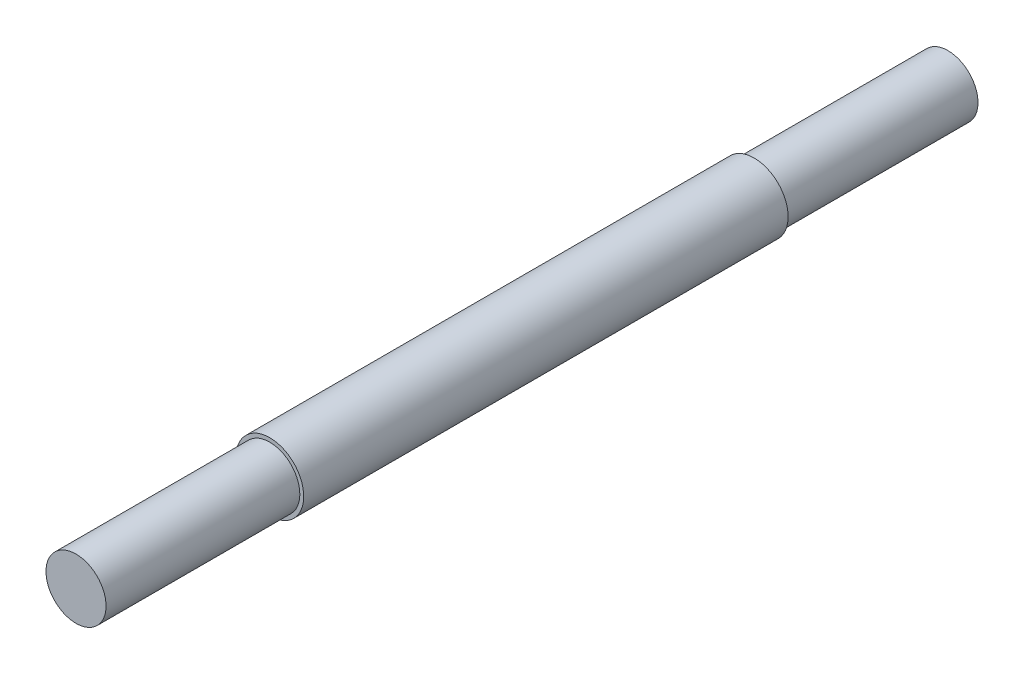
ISO-10303-21;
HEADER;
FILE_DESCRIPTION(('STEP AP214'),'2;1');
FILE_NAME('part.step','',(''),(''),'','','');
FILE_SCHEMA(('AUTOMOTIVE_DESIGN { 1 0 10303 214 1 1 1 1 }'));
ENDSEC;
DATA;
#1=APPLICATION_CONTEXT('core data for automotive mechanical design processes');
#2=APPLICATION_PROTOCOL_DEFINITION('international standard','automotive_design',2000,#1);
#3=PRODUCT_CONTEXT('',#1,'mechanical');
#4=PRODUCT('Part','Part','',(#3));
#5=PRODUCT_RELATED_PRODUCT_CATEGORY('part','',(#4));
#6=PRODUCT_DEFINITION_FORMATION('','',#4);
#7=PRODUCT_DEFINITION_CONTEXT('part definition',#1,'design');
#8=PRODUCT_DEFINITION('design','',#6,#7);
#9=PRODUCT_DEFINITION_SHAPE('','',#8);
#10=(LENGTH_UNIT() NAMED_UNIT(*) SI_UNIT(.MILLI.,.METRE.));
#11=(NAMED_UNIT(*) PLANE_ANGLE_UNIT() SI_UNIT($,.RADIAN.));
#12=(NAMED_UNIT(*) SI_UNIT($,.STERADIAN.) SOLID_ANGLE_UNIT());
#13=UNCERTAINTY_MEASURE_WITH_UNIT(LENGTH_MEASURE(1.E-05),#10,'distance_accuracy_value','');
#14=(GEOMETRIC_REPRESENTATION_CONTEXT(3) GLOBAL_UNCERTAINTY_ASSIGNED_CONTEXT((#13)) GLOBAL_UNIT_ASSIGNED_CONTEXT((#10,
#11,#12)) REPRESENTATION_CONTEXT('',''));
#15=CARTESIAN_POINT('',(0.,0.,0.));
#16=DIRECTION('',(0.,0.,1.));
#17=DIRECTION('',(1.,0.,0.));
#18=AXIS2_PLACEMENT_3D('',#15,#16,#17);
#19=CARTESIAN_POINT('',(0.,1.55,-22.5));
#20=DIRECTION('',(0.,0.,-1.));
#21=DIRECTION('',(0.,1.,0.));
#22=AXIS2_PLACEMENT_3D('',#19,#20,#21);
#23=PLANE('',#22);
#24=CARTESIAN_POINT('',(0.,0.,-22.5));
#25=DIRECTION('',(0.,0.,-1.));
#26=DIRECTION('',(0.,1.,0.));
#27=AXIS2_PLACEMENT_3D('',#24,#25,#26);
#28=CIRCLE('',#27,1.55);
#29=CARTESIAN_POINT('',(0.,1.55,-22.5));
#30=VERTEX_POINT('',#29);
#31=EDGE_CURVE('E56',#30,#30,#28,.T.);
#32=ORIENTED_EDGE('',*,*,#31,.T.);
#33=EDGE_LOOP('',(#32));
#34=FACE_BOUND('',#33,.T.);
#35=ADVANCED_FACE('F34',(#34),#23,.T.);
#36=CARTESIAN_POINT('',(0.,0.,22.5));
#37=DIRECTION('',(0.,0.,1.));
#38=DIRECTION('',(0.,-1.,0.));
#39=AXIS2_PLACEMENT_3D('',#36,#37,#38);
#40=PLANE('',#39);
#41=CARTESIAN_POINT('',(0.,0.,22.5));
#42=DIRECTION('',(0.,0.,-1.));
#43=DIRECTION('',(0.,1.,0.));
#44=AXIS2_PLACEMENT_3D('',#41,#42,#43);
#45=CIRCLE('',#44,1.55);
#46=CARTESIAN_POINT('',(0.,1.55,22.5));
#47=VERTEX_POINT('',#46);
#48=EDGE_CURVE('E10',#47,#47,#45,.T.);
#49=ORIENTED_EDGE('',*,*,#48,.F.);
#50=EDGE_LOOP('',(#49));
#51=FACE_BOUND('',#50,.T.);
#52=ADVANCED_FACE('F73',(#51),#40,.T.);
#53=CARTESIAN_POINT('',(0.,0.,0.));
#54=DIRECTION('',(0.,0.,-1.));
#55=DIRECTION('',(0.,1.,0.));
#56=AXIS2_PLACEMENT_3D('',#53,#54,#55);
#57=CYLINDRICAL_SURFACE('',#56,1.55);
#58=ORIENTED_EDGE('',*,*,#48,.T.);
#59=EDGE_LOOP('',(#58));
#60=FACE_BOUND('',#59,.T.);
#61=CARTESIAN_POINT('',(0.,0.,12.5));
#62=DIRECTION('',(0.,0.,-1.));
#63=DIRECTION('',(0.,1.,0.));
#64=AXIS2_PLACEMENT_3D('',#61,#62,#63);
#65=CIRCLE('',#64,1.55);
#66=CARTESIAN_POINT('',(0.,1.55,12.5));
#67=VERTEX_POINT('',#66);
#68=EDGE_CURVE('E40',#67,#67,#65,.T.);
#69=ORIENTED_EDGE('',*,*,#68,.F.);
#70=EDGE_LOOP('',(#69));
#71=FACE_BOUND('',#70,.T.);
#72=ADVANCED_FACE('F77',(#60,#71),#57,.T.);
#73=CARTESIAN_POINT('',(0.,1.55,12.5));
#74=DIRECTION('',(0.,0.,1.));
#75=DIRECTION('',(0.,-1.,0.));
#76=AXIS2_PLACEMENT_3D('',#73,#74,#75);
#77=PLANE('',#76);
#78=ORIENTED_EDGE('',*,*,#68,.T.);
#79=EDGE_LOOP('',(#78));
#80=FACE_BOUND('',#79,.T.);
#81=CARTESIAN_POINT('',(0.,0.,12.5));
#82=DIRECTION('',(0.,0.,-1.));
#83=DIRECTION('',(0.,1.,0.));
#84=AXIS2_PLACEMENT_3D('',#81,#82,#83);
#85=CIRCLE('',#84,1.75);
#86=CARTESIAN_POINT('',(0.,1.75,12.5));
#87=VERTEX_POINT('',#86);
#88=EDGE_CURVE('E44',#87,#87,#85,.T.);
#89=ORIENTED_EDGE('',*,*,#88,.F.);
#90=EDGE_LOOP('',(#89));
#91=FACE_BOUND('',#90,.T.);
#92=ADVANCED_FACE('F82',(#80,#91),#77,.T.);
#93=CARTESIAN_POINT('',(0.,0.,0.));
#94=DIRECTION('',(0.,0.,-1.));
#95=DIRECTION('',(0.,1.,0.));
#96=AXIS2_PLACEMENT_3D('',#93,#94,#95);
#97=CYLINDRICAL_SURFACE('',#96,1.75);
#98=ORIENTED_EDGE('',*,*,#88,.T.);
#99=EDGE_LOOP('',(#98));
#100=FACE_BOUND('',#99,.T.);
#101=CARTESIAN_POINT('',(0.,0.,-12.5));
#102=DIRECTION('',(0.,0.,-1.));
#103=DIRECTION('',(0.,1.,0.));
#104=AXIS2_PLACEMENT_3D('',#101,#102,#103);
#105=CIRCLE('',#104,1.75);
#106=CARTESIAN_POINT('',(0.,1.75,-12.5));
#107=VERTEX_POINT('',#106);
#108=EDGE_CURVE('E48',#107,#107,#105,.T.);
#109=ORIENTED_EDGE('',*,*,#108,.F.);
#110=EDGE_LOOP('',(#109));
#111=FACE_BOUND('',#110,.T.);
#112=ADVANCED_FACE('F69',(#100,#111),#97,.T.);
#113=CARTESIAN_POINT('',(0.,1.75,-12.5));
#114=DIRECTION('',(0.,0.,-1.));
#115=DIRECTION('',(0.,1.,0.));
#116=AXIS2_PLACEMENT_3D('',#113,#114,#115);
#117=PLANE('',#116);
#118=ORIENTED_EDGE('',*,*,#108,.T.);
#119=EDGE_LOOP('',(#118));
#120=FACE_BOUND('',#119,.T.);
#121=CARTESIAN_POINT('',(0.,0.,-12.5));
#122=DIRECTION('',(0.,0.,-1.));
#123=DIRECTION('',(0.,1.,0.));
#124=AXIS2_PLACEMENT_3D('',#121,#122,#123);
#125=CIRCLE('',#124,1.55);
#126=CARTESIAN_POINT('',(0.,1.55,-12.5));
#127=VERTEX_POINT('',#126);
#128=EDGE_CURVE('E53',#127,#127,#125,.T.);
#129=ORIENTED_EDGE('',*,*,#128,.F.);
#130=EDGE_LOOP('',(#129));
#131=FACE_BOUND('',#130,.T.);
#132=ADVANCED_FACE('F63',(#120,#131),#117,.T.);
#133=CARTESIAN_POINT('',(0.,0.,0.));
#134=DIRECTION('',(0.,0.,-1.));
#135=DIRECTION('',(0.,1.,0.));
#136=AXIS2_PLACEMENT_3D('',#133,#134,#135);
#137=CYLINDRICAL_SURFACE('',#136,1.55);
#138=ORIENTED_EDGE('',*,*,#128,.T.);
#139=EDGE_LOOP('',(#138));
#140=FACE_BOUND('',#139,.T.);
#141=ORIENTED_EDGE('',*,*,#31,.F.);
#142=EDGE_LOOP('',(#141));
#143=FACE_BOUND('',#142,.T.);
#144=ADVANCED_FACE('F61',(#140,#143),#137,.T.);
#145=CLOSED_SHELL('',(#35,#52,#72,#92,#112,#132,#144));
#146=MANIFOLD_SOLID_BREP('B2',#145);
#147=ADVANCED_BREP_SHAPE_REPRESENTATION('',(#18,#146),#14);
#148=SHAPE_DEFINITION_REPRESENTATION(#9,#147);
ENDSEC;
END-ISO-10303-21;
